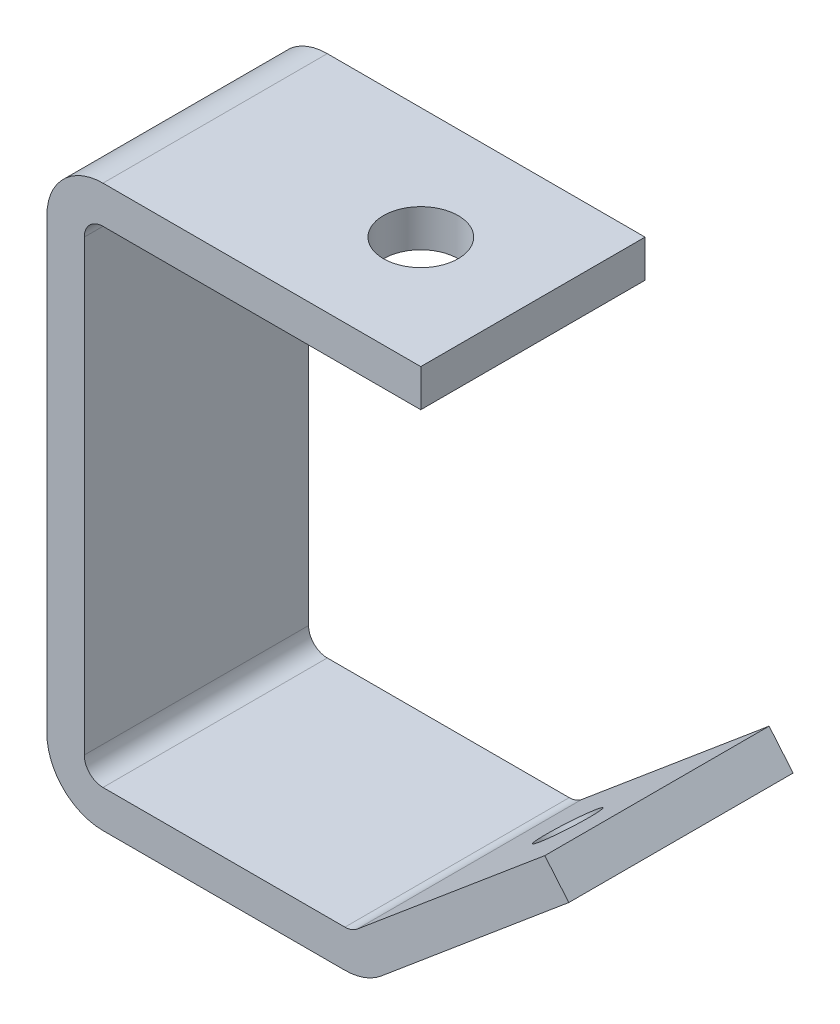
ISO-10303-21;
HEADER;
FILE_DESCRIPTION(('STEP AP214'),'2;1');
FILE_NAME('part.step','',(''),(''),'','','');
FILE_SCHEMA(('AUTOMOTIVE_DESIGN { 1 0 10303 214 1 1 1 1 }'));
ENDSEC;
DATA;
#1=APPLICATION_CONTEXT('core data for automotive mechanical design processes');
#2=APPLICATION_PROTOCOL_DEFINITION('international standard','automotive_design',2000,#1);
#3=PRODUCT_CONTEXT('',#1,'mechanical');
#4=PRODUCT('Part','Part','',(#3));
#5=PRODUCT_RELATED_PRODUCT_CATEGORY('part','',(#4));
#6=PRODUCT_DEFINITION_FORMATION('','',#4);
#7=PRODUCT_DEFINITION_CONTEXT('part definition',#1,'design');
#8=PRODUCT_DEFINITION('design','',#6,#7);
#9=PRODUCT_DEFINITION_SHAPE('','',#8);
#10=(LENGTH_UNIT() NAMED_UNIT(*) SI_UNIT(.MILLI.,.METRE.));
#11=(NAMED_UNIT(*) PLANE_ANGLE_UNIT() SI_UNIT($,.RADIAN.));
#12=(NAMED_UNIT(*) SI_UNIT($,.STERADIAN.) SOLID_ANGLE_UNIT());
#13=UNCERTAINTY_MEASURE_WITH_UNIT(LENGTH_MEASURE(1.E-05),#10,'distance_accuracy_value','');
#14=(GEOMETRIC_REPRESENTATION_CONTEXT(3) GLOBAL_UNCERTAINTY_ASSIGNED_CONTEXT((#13)) GLOBAL_UNIT_ASSIGNED_CONTEXT((#10,
#11,#12)) REPRESENTATION_CONTEXT('',''));
#15=CARTESIAN_POINT('',(0.,0.,0.));
#16=DIRECTION('',(0.,0.,1.));
#17=DIRECTION('',(1.,0.,0.));
#18=AXIS2_PLACEMENT_3D('',#15,#16,#17);
#19=CARTESIAN_POINT('',(-3.49411424895551,9.6,19.05));
#20=DIRECTION('',(0.,0.,-1.));
#21=DIRECTION('',(-1.,0.,0.));
#22=AXIS2_PLACEMENT_3D('',#19,#20,#21);
#23=CYLINDRICAL_SURFACE('',#22,3.25);
#24=CARTESIAN_POINT('',(-3.49411424895551,9.6,-19.05));
#25=DIRECTION('',(0.,0.,-1.));
#26=DIRECTION('',(1.,0.,0.));
#27=AXIS2_PLACEMENT_3D('',#24,#25,#26);
#28=CIRCLE('',#27,3.25);
#29=CARTESIAN_POINT('',(-1.40505451747424,7.11035555986333,-19.05));
#30=VERTEX_POINT('',#29);
#31=CARTESIAN_POINT('',(-3.49411424895553,6.35,-19.05));
#32=VERTEX_POINT('',#31);
#33=EDGE_CURVE('E176',#30,#32,#28,.T.);
#34=ORIENTED_EDGE('',*,*,#33,.T.);
#35=DIRECTION('',(0.,0.,-1.));
#36=VECTOR('',#35,1.);
#37=CARTESIAN_POINT('',(-3.49411424895553,6.35,19.05));
#38=LINE('',#37,#36);
#39=CARTESIAN_POINT('',(-3.49411424895553,6.35,19.05));
#40=VERTEX_POINT('',#39);
#41=EDGE_CURVE('E11',#40,#32,#38,.T.);
#42=ORIENTED_EDGE('',*,*,#41,.F.);
#43=CARTESIAN_POINT('',(-3.49411424895551,9.6,19.05));
#44=DIRECTION('',(0.,0.,-1.));
#45=DIRECTION('',(1.,0.,0.));
#46=AXIS2_PLACEMENT_3D('',#43,#44,#45);
#47=CIRCLE('',#46,3.25);
#48=CARTESIAN_POINT('',(-1.40505451747424,7.11035555986333,19.05));
#49=VERTEX_POINT('',#48);
#50=EDGE_CURVE('E207',#49,#40,#47,.T.);
#51=ORIENTED_EDGE('',*,*,#50,.F.);
#52=DIRECTION('',(0.,0.,-1.));
#53=VECTOR('',#52,1.);
#54=CARTESIAN_POINT('',(-1.40505451747424,7.11035555986333,19.05));
#55=LINE('',#54,#53);
#56=EDGE_CURVE('E172',#49,#30,#55,.T.);
#57=ORIENTED_EDGE('',*,*,#56,.T.);
#58=EDGE_LOOP('',(#34,#42,#51,#57));
#59=FACE_BOUND('',#58,.T.);
#60=ADVANCED_FACE('F32',(#59),#23,.F.);
#61=CARTESIAN_POINT('',(-3.49411424895553,6.35,19.05));
#62=DIRECTION('',(0.,-1.,0.));
#63=DIRECTION('',(0.,0.,-1.));
#64=AXIS2_PLACEMENT_3D('',#61,#62,#63);
#65=PLANE('',#64);
#66=DIRECTION('',(-1.,0.,0.));
#67=VECTOR('',#66,1.);
#68=CARTESIAN_POINT('',(-3.49411424895553,6.35,-19.05));
#69=LINE('',#68,#67);
#70=CARTESIAN_POINT('',(-44.5899999999999,6.35,-19.05));
#71=VERTEX_POINT('',#70);
#72=EDGE_CURVE('E179',#32,#71,#69,.T.);
#73=ORIENTED_EDGE('',*,*,#72,.T.);
#74=DIRECTION('',(0.,0.,-1.));
#75=VECTOR('',#74,1.);
#76=CARTESIAN_POINT('',(-44.5899999999999,6.35,19.05));
#77=LINE('',#76,#75);
#78=CARTESIAN_POINT('',(-44.5899999999999,6.35,19.05));
#79=VERTEX_POINT('',#78);
#80=EDGE_CURVE('E40',#79,#71,#77,.T.);
#81=ORIENTED_EDGE('',*,*,#80,.F.);
#82=DIRECTION('',(-1.,0.,0.));
#83=VECTOR('',#82,1.);
#84=CARTESIAN_POINT('',(-3.49411424895553,6.35,19.05));
#85=LINE('',#84,#83);
#86=EDGE_CURVE('E115',#40,#79,#85,.T.);
#87=ORIENTED_EDGE('',*,*,#86,.F.);
#88=ORIENTED_EDGE('',*,*,#41,.T.);
#89=EDGE_LOOP('',(#73,#81,#87,#88));
#90=FACE_BOUND('',#89,.T.);
#91=ADVANCED_FACE('F307',(#90),#65,.F.);
#92=CARTESIAN_POINT('',(-44.59,9.53,19.05));
#93=DIRECTION('',(0.,0.,-1.));
#94=DIRECTION('',(-1.,0.,0.));
#95=AXIS2_PLACEMENT_3D('',#92,#93,#94);
#96=CYLINDRICAL_SURFACE('',#95,3.18);
#97=CARTESIAN_POINT('',(-44.59,9.53,-19.05));
#98=DIRECTION('',(0.,0.,-1.));
#99=DIRECTION('',(-1.,0.,0.));
#100=AXIS2_PLACEMENT_3D('',#97,#98,#99);
#101=CIRCLE('',#100,3.18);
#102=CARTESIAN_POINT('',(-47.77,9.53000000000002,-19.05));
#103=VERTEX_POINT('',#102);
#104=EDGE_CURVE('E182',#71,#103,#101,.T.);
#105=ORIENTED_EDGE('',*,*,#104,.T.);
#106=DIRECTION('',(0.,0.,-1.));
#107=VECTOR('',#106,1.);
#108=CARTESIAN_POINT('',(-47.77,9.53000000000002,19.05));
#109=LINE('',#108,#107);
#110=CARTESIAN_POINT('',(-47.77,9.53000000000002,19.05));
#111=VERTEX_POINT('',#110);
#112=EDGE_CURVE('E238',#111,#103,#109,.T.);
#113=ORIENTED_EDGE('',*,*,#112,.F.);
#114=CARTESIAN_POINT('',(-44.59,9.53,19.05));
#115=DIRECTION('',(0.,0.,-1.));
#116=DIRECTION('',(-1.,0.,0.));
#117=AXIS2_PLACEMENT_3D('',#114,#115,#116);
#118=CIRCLE('',#117,3.18);
#119=EDGE_CURVE('E246',#79,#111,#118,.T.);
#120=ORIENTED_EDGE('',*,*,#119,.F.);
#121=ORIENTED_EDGE('',*,*,#80,.T.);
#122=EDGE_LOOP('',(#105,#113,#120,#121));
#123=FACE_BOUND('',#122,.T.);
#124=ADVANCED_FACE('F244',(#123),#96,.F.);
#125=CARTESIAN_POINT('',(-47.77,9.53000000000002,19.05));
#126=DIRECTION('',(-1.,0.,0.));
#127=DIRECTION('',(0.,0.,1.));
#128=AXIS2_PLACEMENT_3D('',#125,#126,#127);
#129=PLANE('',#128);
#130=DIRECTION('',(0.,1.,0.));
#131=VECTOR('',#130,1.);
#132=CARTESIAN_POINT('',(-47.77,9.53000000000002,-19.05));
#133=LINE('',#132,#131);
#134=CARTESIAN_POINT('',(-47.77,85.7199999999999,-19.05));
#135=VERTEX_POINT('',#134);
#136=EDGE_CURVE('E184',#103,#135,#133,.T.);
#137=ORIENTED_EDGE('',*,*,#136,.T.);
#138=DIRECTION('',(0.,0.,-1.));
#139=VECTOR('',#138,1.);
#140=CARTESIAN_POINT('',(-47.77,85.7199999999999,19.05));
#141=LINE('',#140,#139);
#142=CARTESIAN_POINT('',(-47.77,85.7199999999999,19.05));
#143=VERTEX_POINT('',#142);
#144=EDGE_CURVE('E235',#143,#135,#141,.T.);
#145=ORIENTED_EDGE('',*,*,#144,.F.);
#146=DIRECTION('',(0.,1.,0.));
#147=VECTOR('',#146,1.);
#148=CARTESIAN_POINT('',(-47.77,9.53000000000002,19.05));
#149=LINE('',#148,#147);
#150=EDGE_CURVE('E264',#111,#143,#149,.T.);
#151=ORIENTED_EDGE('',*,*,#150,.F.);
#152=ORIENTED_EDGE('',*,*,#112,.T.);
#153=EDGE_LOOP('',(#137,#145,#151,#152));
#154=FACE_BOUND('',#153,.T.);
#155=ADVANCED_FACE('F255',(#154),#129,.F.);
#156=CARTESIAN_POINT('',(-44.59,85.72,19.05));
#157=DIRECTION('',(0.,0.,-1.));
#158=DIRECTION('',(-1.,0.,0.));
#159=AXIS2_PLACEMENT_3D('',#156,#157,#158);
#160=CYLINDRICAL_SURFACE('',#159,3.18);
#161=CARTESIAN_POINT('',(-44.59,85.72,-19.05));
#162=DIRECTION('',(0.,0.,-1.));
#163=DIRECTION('',(-1.,0.,0.));
#164=AXIS2_PLACEMENT_3D('',#161,#162,#163);
#165=CIRCLE('',#164,3.18);
#166=CARTESIAN_POINT('',(-44.59,88.9,-19.05));
#167=VERTEX_POINT('',#166);
#168=EDGE_CURVE('E186',#135,#167,#165,.T.);
#169=ORIENTED_EDGE('',*,*,#168,.T.);
#170=DIRECTION('',(0.,0.,-1.));
#171=VECTOR('',#170,1.);
#172=CARTESIAN_POINT('',(-44.59,88.9,19.05));
#173=LINE('',#172,#171);
#174=CARTESIAN_POINT('',(-44.59,88.9,19.05));
#175=VERTEX_POINT('',#174);
#176=EDGE_CURVE('E232',#175,#167,#173,.T.);
#177=ORIENTED_EDGE('',*,*,#176,.F.);
#178=CARTESIAN_POINT('',(-44.59,85.72,19.05));
#179=DIRECTION('',(0.,0.,-1.));
#180=DIRECTION('',(-1.,0.,0.));
#181=AXIS2_PLACEMENT_3D('',#178,#179,#180);
#182=CIRCLE('',#181,3.18);
#183=EDGE_CURVE('E261',#143,#175,#182,.T.);
#184=ORIENTED_EDGE('',*,*,#183,.F.);
#185=ORIENTED_EDGE('',*,*,#144,.T.);
#186=EDGE_LOOP('',(#169,#177,#184,#185));
#187=FACE_BOUND('',#186,.T.);
#188=ADVANCED_FACE('F259',(#187),#160,.F.);
#189=CARTESIAN_POINT('',(-44.59,88.9,19.05));
#190=DIRECTION('',(0.,1.,0.));
#191=DIRECTION('',(0.,0.,1.));
#192=AXIS2_PLACEMENT_3D('',#189,#190,#191);
#193=PLANE('',#192);
#194=CARTESIAN_POINT('',(-9.65,88.9,0.));
#195=DIRECTION('',(0.,1.,0.));
#196=DIRECTION('',(0.,0.,1.));
#197=AXIS2_PLACEMENT_3D('',#194,#195,#196);
#198=CIRCLE('',#197,6.35);
#199=CARTESIAN_POINT('',(-9.65,88.9,6.35));
#200=VERTEX_POINT('',#199);
#201=EDGE_CURVE('E180',#200,#200,#198,.T.);
#202=ORIENTED_EDGE('',*,*,#201,.T.);
#203=EDGE_LOOP('',(#202));
#204=FACE_BOUND('',#203,.T.);
#205=DIRECTION('',(1.,0.,0.));
#206=VECTOR('',#205,1.);
#207=CARTESIAN_POINT('',(-44.59,88.9,-19.05));
#208=LINE('',#207,#206);
#209=CARTESIAN_POINT('',(9.39,88.9,-19.05));
#210=VERTEX_POINT('',#209);
#211=EDGE_CURVE('E188',#167,#210,#208,.T.);
#212=ORIENTED_EDGE('',*,*,#211,.T.);
#213=DIRECTION('',(0.,0.,-1.));
#214=VECTOR('',#213,1.);
#215=CARTESIAN_POINT('',(9.39,88.9,19.05));
#216=LINE('',#215,#214);
#217=CARTESIAN_POINT('',(9.39,88.9,19.05));
#218=VERTEX_POINT('',#217);
#219=EDGE_CURVE('E229',#218,#210,#216,.T.);
#220=ORIENTED_EDGE('',*,*,#219,.F.);
#221=DIRECTION('',(1.,0.,0.));
#222=VECTOR('',#221,1.);
#223=CARTESIAN_POINT('',(-44.59,88.9,19.05));
#224=LINE('',#223,#222);
#225=EDGE_CURVE('E263',#175,#218,#224,.T.);
#226=ORIENTED_EDGE('',*,*,#225,.F.);
#227=ORIENTED_EDGE('',*,*,#176,.T.);
#228=EDGE_LOOP('',(#212,#220,#226,#227));
#229=FACE_BOUND('',#228,.T.);
#230=ADVANCED_FACE('F320',(#204,#229),#193,.F.);
#231=CARTESIAN_POINT('',(9.39,95.25,19.05));
#232=DIRECTION('',(-1.,0.,0.));
#233=DIRECTION('',(0.,0.,1.));
#234=AXIS2_PLACEMENT_3D('',#231,#232,#233);
#235=PLANE('',#234);
#236=DIRECTION('',(0.,1.,0.));
#237=VECTOR('',#236,1.);
#238=CARTESIAN_POINT('',(9.39,95.25,-19.05));
#239=LINE('',#238,#237);
#240=CARTESIAN_POINT('',(9.39,95.25,-19.05));
#241=VERTEX_POINT('',#240);
#242=EDGE_CURVE('E190',#210,#241,#239,.T.);
#243=ORIENTED_EDGE('',*,*,#242,.T.);
#244=DIRECTION('',(0.,0.,-1.));
#245=VECTOR('',#244,1.);
#246=CARTESIAN_POINT('',(9.39,95.25,19.05));
#247=LINE('',#246,#245);
#248=CARTESIAN_POINT('',(9.39,95.25,19.05));
#249=VERTEX_POINT('',#248);
#250=EDGE_CURVE('E226',#249,#241,#247,.T.);
#251=ORIENTED_EDGE('',*,*,#250,.F.);
#252=DIRECTION('',(0.,1.,0.));
#253=VECTOR('',#252,1.);
#254=CARTESIAN_POINT('',(9.39,95.25,19.05));
#255=LINE('',#254,#253);
#256=EDGE_CURVE('E266',#218,#249,#255,.T.);
#257=ORIENTED_EDGE('',*,*,#256,.F.);
#258=ORIENTED_EDGE('',*,*,#219,.T.);
#259=EDGE_LOOP('',(#243,#251,#257,#258));
#260=FACE_BOUND('',#259,.T.);
#261=ADVANCED_FACE('F323',(#260),#235,.F.);
#262=CARTESIAN_POINT('',(-44.5899999999999,95.25,19.05));
#263=DIRECTION('',(0.,-1.,0.));
#264=DIRECTION('',(0.,0.,-1.));
#265=AXIS2_PLACEMENT_3D('',#262,#263,#264);
#266=PLANE('',#265);
#267=CARTESIAN_POINT('',(-9.65,95.25,0.));
#268=DIRECTION('',(0.,1.,0.));
#269=DIRECTION('',(0.,0.,1.));
#270=AXIS2_PLACEMENT_3D('',#267,#268,#269);
#271=CIRCLE('',#270,6.35);
#272=CARTESIAN_POINT('',(-9.65,95.25,6.35));
#273=VERTEX_POINT('',#272);
#274=EDGE_CURVE('E356',#273,#273,#271,.T.);
#275=ORIENTED_EDGE('',*,*,#274,.F.);
#276=EDGE_LOOP('',(#275));
#277=FACE_BOUND('',#276,.T.);
#278=DIRECTION('',(-1.,0.,0.));
#279=VECTOR('',#278,1.);
#280=CARTESIAN_POINT('',(-44.5899999999999,95.25,-19.05));
#281=LINE('',#280,#279);
#282=CARTESIAN_POINT('',(-44.5899999999999,95.25,-19.05));
#283=VERTEX_POINT('',#282);
#284=EDGE_CURVE('E192',#241,#283,#281,.T.);
#285=ORIENTED_EDGE('',*,*,#284,.T.);
#286=DIRECTION('',(0.,0.,-1.));
#287=VECTOR('',#286,1.);
#288=CARTESIAN_POINT('',(-44.5899999999999,95.25,19.05));
#289=LINE('',#288,#287);
#290=CARTESIAN_POINT('',(-44.5899999999999,95.25,19.05));
#291=VERTEX_POINT('',#290);
#292=EDGE_CURVE('E223',#291,#283,#289,.T.);
#293=ORIENTED_EDGE('',*,*,#292,.F.);
#294=DIRECTION('',(-1.,0.,0.));
#295=VECTOR('',#294,1.);
#296=CARTESIAN_POINT('',(-44.5899999999999,95.25,19.05));
#297=LINE('',#296,#295);
#298=EDGE_CURVE('E272',#249,#291,#297,.T.);
#299=ORIENTED_EDGE('',*,*,#298,.F.);
#300=ORIENTED_EDGE('',*,*,#250,.T.);
#301=EDGE_LOOP('',(#285,#293,#299,#300));
#302=FACE_BOUND('',#301,.T.);
#303=ADVANCED_FACE('F327',(#277,#302),#266,.F.);
#304=CARTESIAN_POINT('',(-44.59,85.72,19.05));
#305=DIRECTION('',(0.,0.,-1.));
#306=DIRECTION('',(-1.,0.,0.));
#307=AXIS2_PLACEMENT_3D('',#304,#305,#306);
#308=CYLINDRICAL_SURFACE('',#307,9.53);
#309=CARTESIAN_POINT('',(-44.59,85.72,-19.05));
#310=DIRECTION('',(0.,0.,1.));
#311=DIRECTION('',(-1.,0.,0.));
#312=AXIS2_PLACEMENT_3D('',#309,#310,#311);
#313=CIRCLE('',#312,9.53);
#314=CARTESIAN_POINT('',(-54.12,85.7199999999999,-19.05));
#315=VERTEX_POINT('',#314);
#316=EDGE_CURVE('E194',#283,#315,#313,.T.);
#317=ORIENTED_EDGE('',*,*,#316,.T.);
#318=DIRECTION('',(0.,0.,-1.));
#319=VECTOR('',#318,1.);
#320=CARTESIAN_POINT('',(-54.12,85.7199999999999,19.05));
#321=LINE('',#320,#319);
#322=CARTESIAN_POINT('',(-54.12,85.7199999999999,19.05));
#323=VERTEX_POINT('',#322);
#324=EDGE_CURVE('E220',#323,#315,#321,.T.);
#325=ORIENTED_EDGE('',*,*,#324,.F.);
#326=CARTESIAN_POINT('',(-44.59,85.72,19.05));
#327=DIRECTION('',(0.,0.,1.));
#328=DIRECTION('',(-1.,0.,0.));
#329=AXIS2_PLACEMENT_3D('',#326,#327,#328);
#330=CIRCLE('',#329,9.53);
#331=EDGE_CURVE('E274',#291,#323,#330,.T.);
#332=ORIENTED_EDGE('',*,*,#331,.F.);
#333=ORIENTED_EDGE('',*,*,#292,.T.);
#334=EDGE_LOOP('',(#317,#325,#332,#333));
#335=FACE_BOUND('',#334,.T.);
#336=ADVANCED_FACE('F331',(#335),#308,.T.);
#337=CARTESIAN_POINT('',(-54.12,9.53000000000007,19.05));
#338=DIRECTION('',(1.,0.,0.));
#339=DIRECTION('',(0.,0.,-1.));
#340=AXIS2_PLACEMENT_3D('',#337,#338,#339);
#341=PLANE('',#340);
#342=DIRECTION('',(0.,-1.,0.));
#343=VECTOR('',#342,1.);
#344=CARTESIAN_POINT('',(-54.12,9.53000000000007,-19.05));
#345=LINE('',#344,#343);
#346=CARTESIAN_POINT('',(-54.12,9.53,-19.05));
#347=VERTEX_POINT('',#346);
#348=EDGE_CURVE('E196',#315,#347,#345,.T.);
#349=ORIENTED_EDGE('',*,*,#348,.T.);
#350=DIRECTION('',(0.,0.,-1.));
#351=VECTOR('',#350,1.);
#352=CARTESIAN_POINT('',(-54.12,9.53,19.05));
#353=LINE('',#352,#351);
#354=CARTESIAN_POINT('',(-54.12,9.53,19.05));
#355=VERTEX_POINT('',#354);
#356=EDGE_CURVE('E217',#355,#347,#353,.T.);
#357=ORIENTED_EDGE('',*,*,#356,.F.);
#358=DIRECTION('',(0.,-1.,0.));
#359=VECTOR('',#358,1.);
#360=CARTESIAN_POINT('',(-54.12,9.53000000000007,19.05));
#361=LINE('',#360,#359);
#362=EDGE_CURVE('E276',#323,#355,#361,.T.);
#363=ORIENTED_EDGE('',*,*,#362,.F.);
#364=ORIENTED_EDGE('',*,*,#324,.T.);
#365=EDGE_LOOP('',(#349,#357,#363,#364));
#366=FACE_BOUND('',#365,.T.);
#367=ADVANCED_FACE('F335',(#366),#341,.F.);
#368=CARTESIAN_POINT('',(-44.59,9.53,19.05));
#369=DIRECTION('',(0.,0.,-1.));
#370=DIRECTION('',(-1.,0.,0.));
#371=AXIS2_PLACEMENT_3D('',#368,#369,#370);
#372=CYLINDRICAL_SURFACE('',#371,9.53);
#373=CARTESIAN_POINT('',(-44.59,9.53,-19.05));
#374=DIRECTION('',(0.,0.,1.));
#375=DIRECTION('',(-1.,0.,0.));
#376=AXIS2_PLACEMENT_3D('',#373,#374,#375);
#377=CIRCLE('',#376,9.53);
#378=CARTESIAN_POINT('',(-44.5899999999999,0.,-19.05));
#379=VERTEX_POINT('',#378);
#380=EDGE_CURVE('E198',#347,#379,#377,.T.);
#381=ORIENTED_EDGE('',*,*,#380,.T.);
#382=DIRECTION('',(0.,0.,-1.));
#383=VECTOR('',#382,1.);
#384=CARTESIAN_POINT('',(-44.5899999999999,0.,19.05));
#385=LINE('',#384,#383);
#386=CARTESIAN_POINT('',(-44.5899999999999,0.,19.05));
#387=VERTEX_POINT('',#386);
#388=EDGE_CURVE('E214',#387,#379,#385,.T.);
#389=ORIENTED_EDGE('',*,*,#388,.F.);
#390=CARTESIAN_POINT('',(-44.59,9.53,19.05));
#391=DIRECTION('',(0.,0.,1.));
#392=DIRECTION('',(-1.,0.,0.));
#393=AXIS2_PLACEMENT_3D('',#390,#391,#392);
#394=CIRCLE('',#393,9.53);
#395=EDGE_CURVE('E278',#355,#387,#394,.T.);
#396=ORIENTED_EDGE('',*,*,#395,.F.);
#397=ORIENTED_EDGE('',*,*,#356,.T.);
#398=EDGE_LOOP('',(#381,#389,#396,#397));
#399=FACE_BOUND('',#398,.T.);
#400=ADVANCED_FACE('F339',(#399),#372,.T.);
#401=CARTESIAN_POINT('',(-3.49411424895555,0.,19.05));
#402=DIRECTION('',(0.,1.,0.));
#403=DIRECTION('',(0.,0.,1.));
#404=AXIS2_PLACEMENT_3D('',#401,#402,#403);
#405=PLANE('',#404);
#406=DIRECTION('',(1.,0.,0.));
#407=VECTOR('',#406,1.);
#408=CARTESIAN_POINT('',(-3.49411424895555,0.,-19.05));
#409=LINE('',#408,#407);
#410=CARTESIAN_POINT('',(-3.49411424895556,0.,-19.05));
#411=VERTEX_POINT('',#410);
#412=EDGE_CURVE('E200',#379,#411,#409,.T.);
#413=ORIENTED_EDGE('',*,*,#412,.T.);
#414=DIRECTION('',(0.,0.,-1.));
#415=VECTOR('',#414,1.);
#416=CARTESIAN_POINT('',(-3.49411424895556,0.,19.05));
#417=LINE('',#416,#415);
#418=CARTESIAN_POINT('',(-3.49411424895556,0.,19.05));
#419=VERTEX_POINT('',#418);
#420=EDGE_CURVE('E211',#419,#411,#417,.T.);
#421=ORIENTED_EDGE('',*,*,#420,.F.);
#422=DIRECTION('',(1.,0.,0.));
#423=VECTOR('',#422,1.);
#424=CARTESIAN_POINT('',(-3.49411424895555,0.,19.05));
#425=LINE('',#424,#423);
#426=EDGE_CURVE('E280',#387,#419,#425,.T.);
#427=ORIENTED_EDGE('',*,*,#426,.F.);
#428=ORIENTED_EDGE('',*,*,#388,.T.);
#429=EDGE_LOOP('',(#413,#421,#427,#428));
#430=FACE_BOUND('',#429,.T.);
#431=ADVANCED_FACE('F286',(#430),#405,.F.);
#432=CARTESIAN_POINT('',(-3.49411424895551,9.6,19.05));
#433=DIRECTION('',(0.,0.,-1.));
#434=DIRECTION('',(-1.,0.,0.));
#435=AXIS2_PLACEMENT_3D('',#432,#433,#434);
#436=CYLINDRICAL_SURFACE('',#435,9.6);
#437=CARTESIAN_POINT('',(-3.49411424895551,9.6,-19.05));
#438=DIRECTION('',(0.,0.,1.));
#439=DIRECTION('',(1.,0.,0.));
#440=AXIS2_PLACEMENT_3D('',#437,#438,#439);
#441=CIRCLE('',#440,9.6);
#442=CARTESIAN_POINT('',(2.67664680403525,2.2459733460578,-19.05));
#443=VERTEX_POINT('',#442);
#444=EDGE_CURVE('E202',#411,#443,#441,.T.);
#445=ORIENTED_EDGE('',*,*,#444,.T.);
#446=DIRECTION('',(0.,0.,-1.));
#447=VECTOR('',#446,1.);
#448=CARTESIAN_POINT('',(2.67664680403525,2.2459733460578,19.05));
#449=LINE('',#448,#447);
#450=CARTESIAN_POINT('',(2.67664680403525,2.2459733460578,19.05));
#451=VERTEX_POINT('',#450);
#452=EDGE_CURVE('E167',#451,#443,#449,.T.);
#453=ORIENTED_EDGE('',*,*,#452,.F.);
#454=CARTESIAN_POINT('',(-3.49411424895551,9.6,19.05));
#455=DIRECTION('',(0.,0.,1.));
#456=DIRECTION('',(1.,0.,0.));
#457=AXIS2_PLACEMENT_3D('',#454,#455,#456);
#458=CIRCLE('',#457,9.6);
#459=EDGE_CURVE('E158',#419,#451,#458,.T.);
#460=ORIENTED_EDGE('',*,*,#459,.F.);
#461=ORIENTED_EDGE('',*,*,#420,.T.);
#462=EDGE_LOOP('',(#445,#453,#460,#461));
#463=FACE_BOUND('',#462,.T.);
#464=ADVANCED_FACE('F290',(#463),#436,.T.);
#465=CARTESIAN_POINT('',(2.67664680403525,2.2459733460578,19.05));
#466=DIRECTION('',(-0.642787609686535,0.766044443118981,0.));
#467=DIRECTION('',(-0.766044443118982,-0.642787609686535,0.));
#468=AXIS2_PLACEMENT_3D('',#465,#466,#467);
#469=PLANE('',#468);
#470=CARTESIAN_POINT('',(19.373263966479,16.2560986489725,0.));
#471=DIRECTION('',(-0.642787609686535,0.766044443118981,0.));
#472=DIRECTION('',(-0.766044443118982,-0.642787609686535,0.));
#473=AXIS2_PLACEMENT_3D('',#470,#471,#472);
#474=CIRCLE('',#473,4.765);
#475=CARTESIAN_POINT('',(15.7230621950171,13.1932156888161,0.));
#476=VERTEX_POINT('',#475);
#477=EDGE_CURVE('E354',#476,#476,#474,.T.);
#478=ORIENTED_EDGE('',*,*,#477,.T.);
#479=EDGE_LOOP('',(#478));
#480=FACE_BOUND('',#479,.T.);
#481=DIRECTION('',(0.766044443118982,0.642787609686535,0.));
#482=VECTOR('',#481,1.);
#483=CARTESIAN_POINT('',(2.67664680403525,2.2459733460578,-19.05));
#484=LINE('',#483,#482);
#485=CARTESIAN_POINT('',(34.5409439402349,28.9832933207659,-19.05));
#486=VERTEX_POINT('',#485);
#487=EDGE_CURVE('E166',#443,#486,#484,.T.);
#488=ORIENTED_EDGE('',*,*,#487,.T.);
#489=DIRECTION('',(0.,0.,-1.));
#490=VECTOR('',#489,1.);
#491=CARTESIAN_POINT('',(34.5409439402349,28.9832933207659,19.05));
#492=LINE('',#491,#490);
#493=CARTESIAN_POINT('',(34.5409439402349,28.9832933207659,19.05));
#494=VERTEX_POINT('',#493);
#495=EDGE_CURVE('E163',#494,#486,#492,.T.);
#496=ORIENTED_EDGE('',*,*,#495,.F.);
#497=DIRECTION('',(0.766044443118982,0.642787609686535,0.));
#498=VECTOR('',#497,1.);
#499=CARTESIAN_POINT('',(2.67664680403525,2.2459733460578,19.05));
#500=LINE('',#499,#498);
#501=EDGE_CURVE('E152',#451,#494,#500,.T.);
#502=ORIENTED_EDGE('',*,*,#501,.F.);
#503=ORIENTED_EDGE('',*,*,#452,.T.);
#504=EDGE_LOOP('',(#488,#496,#502,#503));
#505=FACE_BOUND('',#504,.T.);
#506=ADVANCED_FACE('F164',(#480,#505),#469,.F.);
#507=CARTESIAN_POINT('',(34.5409439402349,28.9832933207659,19.05));
#508=DIRECTION('',(-0.766044443118982,-0.642787609686535,0.));
#509=DIRECTION('',(0.642787609686535,-0.766044443118982,0.));
#510=AXIS2_PLACEMENT_3D('',#507,#508,#509);
#511=PLANE('',#510);
#512=DIRECTION('',(-0.642787609686535,0.766044443118982,0.));
#513=VECTOR('',#512,1.);
#514=CARTESIAN_POINT('',(34.5409439402349,28.9832933207659,-19.05));
#515=LINE('',#514,#513);
#516=CARTESIAN_POINT('',(30.4592426187254,33.8476755345714,-19.05));
#517=VERTEX_POINT('',#516);
#518=EDGE_CURVE('E101',#486,#517,#515,.T.);
#519=ORIENTED_EDGE('',*,*,#518,.T.);
#520=DIRECTION('',(0.,0.,-1.));
#521=VECTOR('',#520,1.);
#522=CARTESIAN_POINT('',(30.4592426187254,33.8476755345714,19.05));
#523=LINE('',#522,#521);
#524=CARTESIAN_POINT('',(30.4592426187254,33.8476755345714,19.05));
#525=VERTEX_POINT('',#524);
#526=EDGE_CURVE('E168',#525,#517,#523,.T.);
#527=ORIENTED_EDGE('',*,*,#526,.F.);
#528=DIRECTION('',(-0.642787609686535,0.766044443118982,0.));
#529=VECTOR('',#528,1.);
#530=CARTESIAN_POINT('',(34.5409439402349,28.9832933207659,19.05));
#531=LINE('',#530,#529);
#532=EDGE_CURVE('E156',#494,#525,#531,.T.);
#533=ORIENTED_EDGE('',*,*,#532,.F.);
#534=ORIENTED_EDGE('',*,*,#495,.T.);
#535=EDGE_LOOP('',(#519,#527,#533,#534));
#536=FACE_BOUND('',#535,.T.);
#537=ADVANCED_FACE('F170',(#536),#511,.F.);
#538=CARTESIAN_POINT('',(-1.40505451747424,7.11035555986333,19.05));
#539=DIRECTION('',(0.642787609686535,-0.766044443118981,0.));
#540=DIRECTION('',(0.766044443118981,0.642787609686535,0.));
#541=AXIS2_PLACEMENT_3D('',#538,#539,#540);
#542=PLANE('',#541);
#543=CARTESIAN_POINT('',(15.2915626449695,21.120480862778,0.));
#544=DIRECTION('',(-0.642787609686535,0.766044443118981,0.));
#545=DIRECTION('',(-0.766044443118981,-0.642787609686535,0.));
#546=AXIS2_PLACEMENT_3D('',#543,#544,#545);
#547=CIRCLE('',#546,4.765);
#548=CARTESIAN_POINT('',(11.6413608735076,18.0575979026217,0.));
#549=VERTEX_POINT('',#548);
#550=EDGE_CURVE('E357',#549,#549,#547,.T.);
#551=ORIENTED_EDGE('',*,*,#550,.F.);
#552=EDGE_LOOP('',(#551));
#553=FACE_BOUND('',#552,.T.);
#554=DIRECTION('',(-0.766044443118982,-0.642787609686535,0.));
#555=VECTOR('',#554,1.);
#556=CARTESIAN_POINT('',(-1.40505451747424,7.11035555986333,-19.05));
#557=LINE('',#556,#555);
#558=EDGE_CURVE('E107',#517,#30,#557,.T.);
#559=ORIENTED_EDGE('',*,*,#558,.T.);
#560=ORIENTED_EDGE('',*,*,#56,.F.);
#561=DIRECTION('',(-0.766044443118982,-0.642787609686535,0.));
#562=VECTOR('',#561,1.);
#563=CARTESIAN_POINT('',(-1.40505451747424,7.11035555986333,19.05));
#564=LINE('',#563,#562);
#565=EDGE_CURVE('E48',#525,#49,#564,.T.);
#566=ORIENTED_EDGE('',*,*,#565,.F.);
#567=ORIENTED_EDGE('',*,*,#526,.T.);
#568=EDGE_LOOP('',(#559,#560,#566,#567));
#569=FACE_BOUND('',#568,.T.);
#570=ADVANCED_FACE('F294',(#553,#569),#542,.F.);
#571=CARTESIAN_POINT('',(-3.49411424895551,9.6,19.05));
#572=DIRECTION('',(0.,0.,1.));
#573=DIRECTION('',(1.,0.,0.));
#574=AXIS2_PLACEMENT_3D('',#571,#572,#573);
#575=PLANE('',#574);
#576=ORIENTED_EDGE('',*,*,#50,.T.);
#577=ORIENTED_EDGE('',*,*,#86,.T.);
#578=ORIENTED_EDGE('',*,*,#119,.T.);
#579=ORIENTED_EDGE('',*,*,#150,.T.);
#580=ORIENTED_EDGE('',*,*,#183,.T.);
#581=ORIENTED_EDGE('',*,*,#225,.T.);
#582=ORIENTED_EDGE('',*,*,#256,.T.);
#583=ORIENTED_EDGE('',*,*,#298,.T.);
#584=ORIENTED_EDGE('',*,*,#331,.T.);
#585=ORIENTED_EDGE('',*,*,#362,.T.);
#586=ORIENTED_EDGE('',*,*,#395,.T.);
#587=ORIENTED_EDGE('',*,*,#426,.T.);
#588=ORIENTED_EDGE('',*,*,#459,.T.);
#589=ORIENTED_EDGE('',*,*,#501,.T.);
#590=ORIENTED_EDGE('',*,*,#532,.T.);
#591=ORIENTED_EDGE('',*,*,#565,.T.);
#592=EDGE_LOOP('',(#576,#577,#578,#579,#580,#581,#582,#583,#584,#585,#586,#587,#588,#589,#590,#591));
#593=FACE_BOUND('',#592,.T.);
#594=ADVANCED_FACE('F154',(#593),#575,.T.);
#595=CARTESIAN_POINT('',(-3.49411424895551,9.6,-19.05));
#596=DIRECTION('',(0.,0.,1.));
#597=DIRECTION('',(1.,0.,0.));
#598=AXIS2_PLACEMENT_3D('',#595,#596,#597);
#599=PLANE('',#598);
#600=ORIENTED_EDGE('',*,*,#33,.F.);
#601=ORIENTED_EDGE('',*,*,#558,.F.);
#602=ORIENTED_EDGE('',*,*,#518,.F.);
#603=ORIENTED_EDGE('',*,*,#487,.F.);
#604=ORIENTED_EDGE('',*,*,#444,.F.);
#605=ORIENTED_EDGE('',*,*,#412,.F.);
#606=ORIENTED_EDGE('',*,*,#380,.F.);
#607=ORIENTED_EDGE('',*,*,#348,.F.);
#608=ORIENTED_EDGE('',*,*,#316,.F.);
#609=ORIENTED_EDGE('',*,*,#284,.F.);
#610=ORIENTED_EDGE('',*,*,#242,.F.);
#611=ORIENTED_EDGE('',*,*,#211,.F.);
#612=ORIENTED_EDGE('',*,*,#168,.F.);
#613=ORIENTED_EDGE('',*,*,#136,.F.);
#614=ORIENTED_EDGE('',*,*,#104,.F.);
#615=ORIENTED_EDGE('',*,*,#72,.F.);
#616=EDGE_LOOP('',(#600,#601,#602,#603,#604,#605,#606,#607,#608,#609,#610,#611,#612,#613,#614,#615));
#617=FACE_BOUND('',#616,.T.);
#618=ADVANCED_FACE('F250',(#617),#599,.F.);
#619=CARTESIAN_POINT('',(-9.65,73.82,0.));
#620=DIRECTION('',(0.,1.,0.));
#621=DIRECTION('',(0.,0.,1.));
#622=AXIS2_PLACEMENT_3D('',#619,#620,#621);
#623=CYLINDRICAL_SURFACE('',#622,6.35);
#624=ORIENTED_EDGE('',*,*,#274,.T.);
#625=EDGE_LOOP('',(#624));
#626=FACE_BOUND('',#625,.T.);
#627=ORIENTED_EDGE('',*,*,#201,.F.);
#628=EDGE_LOOP('',(#627));
#629=FACE_BOUND('',#628,.T.);
#630=ADVANCED_FACE('F370',(#626,#629),#623,.F.);
#631=CARTESIAN_POINT('',(44.9240714515188,-14.194167965007,0.));
#632=DIRECTION('',(-0.642787609686535,0.766044443118981,0.));
#633=DIRECTION('',(-0.766044443118981,-0.642787609686535,0.));
#634=AXIS2_PLACEMENT_3D('',#631,#632,#633);
#635=CYLINDRICAL_SURFACE('',#634,4.765);
#636=ORIENTED_EDGE('',*,*,#550,.T.);
#637=EDGE_LOOP('',(#636));
#638=FACE_BOUND('',#637,.T.);
#639=ORIENTED_EDGE('',*,*,#477,.F.);
#640=EDGE_LOOP('',(#639));
#641=FACE_BOUND('',#640,.T.);
#642=ADVANCED_FACE('F372',(#638,#641),#635,.F.);
#643=CLOSED_SHELL('',(#60,#91,#124,#155,#188,#230,#261,#303,#336,#367,#400,#431,#464,#506,#537,
#570,#594,#618,#630,#642));
#644=MANIFOLD_SOLID_BREP('B2',#643);
#645=ADVANCED_BREP_SHAPE_REPRESENTATION('',(#18,#644),#14);
#646=SHAPE_DEFINITION_REPRESENTATION(#9,#645);
ENDSEC;
END-ISO-10303-21;
